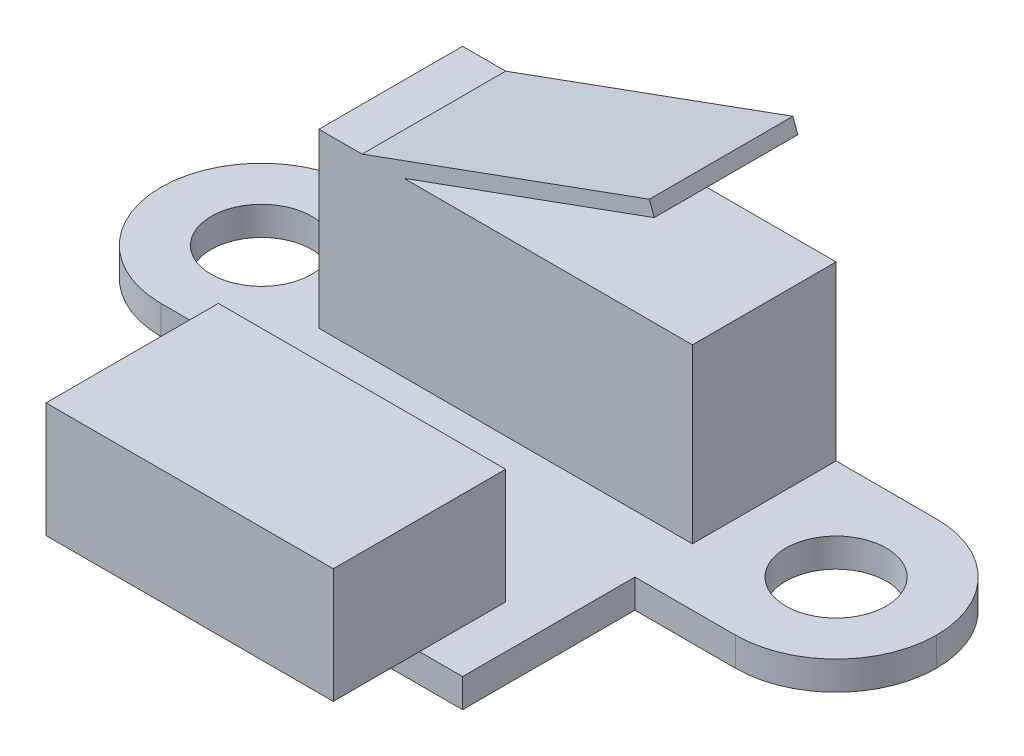
ISO-10303-21;
HEADER;
FILE_DESCRIPTION(('STEP AP214'),'2;1');
FILE_NAME('part.step','',(''),(''),'','','');
FILE_SCHEMA(('AUTOMOTIVE_DESIGN { 1 0 10303 214 1 1 1 1 }'));
ENDSEC;
DATA;
#1=APPLICATION_CONTEXT('core data for automotive mechanical design processes');
#2=APPLICATION_PROTOCOL_DEFINITION('international standard','automotive_design',2000,#1);
#3=PRODUCT_CONTEXT('',#1,'mechanical');
#4=PRODUCT('Part','Part','',(#3));
#5=PRODUCT_RELATED_PRODUCT_CATEGORY('part','',(#4));
#6=PRODUCT_DEFINITION_FORMATION('','',#4);
#7=PRODUCT_DEFINITION_CONTEXT('part definition',#1,'design');
#8=PRODUCT_DEFINITION('design','',#6,#7);
#9=PRODUCT_DEFINITION_SHAPE('','',#8);
#10=(LENGTH_UNIT() NAMED_UNIT(*) SI_UNIT(.MILLI.,.METRE.));
#11=(NAMED_UNIT(*) PLANE_ANGLE_UNIT() SI_UNIT($,.RADIAN.));
#12=(NAMED_UNIT(*) SI_UNIT($,.STERADIAN.) SOLID_ANGLE_UNIT());
#13=UNCERTAINTY_MEASURE_WITH_UNIT(LENGTH_MEASURE(1.E-05),#10,'distance_accuracy_value','');
#14=(GEOMETRIC_REPRESENTATION_CONTEXT(3) GLOBAL_UNCERTAINTY_ASSIGNED_CONTEXT((#13)) GLOBAL_UNIT_ASSIGNED_CONTEXT((#10,
#11,#12)) REPRESENTATION_CONTEXT('',''));
#15=CARTESIAN_POINT('',(0.,0.,0.));
#16=DIRECTION('',(0.,0.,1.));
#17=DIRECTION('',(1.,0.,0.));
#18=AXIS2_PLACEMENT_3D('',#15,#16,#17);
#19=CARTESIAN_POINT('',(0.,7.,0.));
#20=DIRECTION('',(0.,-1.,0.));
#21=DIRECTION('',(0.,0.,-1.));
#22=AXIS2_PLACEMENT_3D('',#19,#20,#21);
#23=PLANE('',#22);
#24=DIRECTION('',(0.,0.,1.));
#25=VECTOR('',#24,1.);
#26=CARTESIAN_POINT('',(-5.,7.,-6.5));
#27=LINE('',#26,#25);
#28=CARTESIAN_POINT('',(-5.,7.,-6.5));
#29=VERTEX_POINT('',#28);
#30=CARTESIAN_POINT('',(-5.,7.,-1.5));
#31=VERTEX_POINT('',#30);
#32=EDGE_CURVE('E229',#29,#31,#27,.T.);
#33=ORIENTED_EDGE('',*,*,#32,.F.);
#34=DIRECTION('',(-1.,0.,0.));
#35=VECTOR('',#34,1.);
#36=CARTESIAN_POINT('',(-6.5,7.,-6.5));
#37=LINE('',#36,#35);
#38=CARTESIAN_POINT('',(-6.5,7.,-6.5));
#39=VERTEX_POINT('',#38);
#40=EDGE_CURVE('E217',#29,#39,#37,.T.);
#41=ORIENTED_EDGE('',*,*,#40,.T.);
#42=DIRECTION('',(0.,0.,1.));
#43=VECTOR('',#42,1.);
#44=CARTESIAN_POINT('',(-6.5,7.,-1.5));
#45=LINE('',#44,#43);
#46=CARTESIAN_POINT('',(-6.5,7.,-1.5));
#47=VERTEX_POINT('',#46);
#48=EDGE_CURVE('E234',#39,#47,#45,.T.);
#49=ORIENTED_EDGE('',*,*,#48,.T.);
#50=DIRECTION('',(1.,0.,0.));
#51=VECTOR('',#50,1.);
#52=CARTESIAN_POINT('',(-6.5,7.,-1.5));
#53=LINE('',#52,#51);
#54=EDGE_CURVE('E709',#47,#31,#53,.T.);
#55=ORIENTED_EDGE('',*,*,#54,.T.);
#56=EDGE_LOOP('',(#33,#41,#49,#55));
#57=FACE_BOUND('',#56,.T.);
#58=ADVANCED_FACE('F34',(#57),#23,.F.);
#59=CARTESIAN_POINT('',(0.,1.,0.));
#60=DIRECTION('',(0.,-1.,0.));
#61=DIRECTION('',(0.,0.,-1.));
#62=AXIS2_PLACEMENT_3D('',#59,#60,#61);
#63=PLANE('',#62);
#64=CARTESIAN_POINT('',(-10.,1.,-3.));
#65=DIRECTION('',(0.,1.,0.));
#66=DIRECTION('',(0.,0.,1.));
#67=AXIS2_PLACEMENT_3D('',#64,#65,#66);
#68=CIRCLE('',#67,1.75);
#69=CARTESIAN_POINT('',(-10.,1.,-1.25));
#70=VERTEX_POINT('',#69);
#71=EDGE_CURVE('E282',#70,#70,#68,.T.);
#72=ORIENTED_EDGE('',*,*,#71,.F.);
#73=EDGE_LOOP('',(#72));
#74=FACE_BOUND('',#73,.T.);
#75=CARTESIAN_POINT('',(10.,1.,-3.));
#76=DIRECTION('',(0.,1.,0.));
#77=DIRECTION('',(0.,0.,1.));
#78=AXIS2_PLACEMENT_3D('',#75,#76,#77);
#79=CIRCLE('',#78,1.75);
#80=CARTESIAN_POINT('',(10.,1.,-1.25));
#81=VERTEX_POINT('',#80);
#82=EDGE_CURVE('E277',#81,#81,#79,.T.);
#83=ORIENTED_EDGE('',*,*,#82,.F.);
#84=EDGE_LOOP('',(#83));
#85=FACE_BOUND('',#84,.T.);
#86=CARTESIAN_POINT('',(10.,1.,-3.));
#87=DIRECTION('',(0.,-1.,0.));
#88=DIRECTION('',(0.,0.,-1.));
#89=AXIS2_PLACEMENT_3D('',#86,#87,#88);
#90=CIRCLE('',#89,3.5);
#91=CARTESIAN_POINT('',(10.,0.999999999999999,0.500000000000001));
#92=VERTEX_POINT('',#91);
#93=CARTESIAN_POINT('',(13.5,1.,-3.));
#94=VERTEX_POINT('',#93);
#95=EDGE_CURVE('E336',#92,#94,#90,.F.);
#96=ORIENTED_EDGE('',*,*,#95,.T.);
#97=CARTESIAN_POINT('',(10.,1.,-3.));
#98=DIRECTION('',(0.,-1.,0.));
#99=DIRECTION('',(0.,0.,-1.));
#100=AXIS2_PLACEMENT_3D('',#97,#98,#99);
#101=CIRCLE('',#100,3.5);
#102=CARTESIAN_POINT('',(9.99999999999999,1.,-6.5));
#103=VERTEX_POINT('',#102);
#104=EDGE_CURVE('E338',#94,#103,#101,.F.);
#105=ORIENTED_EDGE('',*,*,#104,.T.);
#106=DIRECTION('',(-1.,0.,0.));
#107=VECTOR('',#106,1.);
#108=CARTESIAN_POINT('',(-6.5,1.,-6.5));
#109=LINE('',#108,#107);
#110=CARTESIAN_POINT('',(6.5,1.,-6.5));
#111=VERTEX_POINT('',#110);
#112=EDGE_CURVE('E309',#103,#111,#109,.T.);
#113=ORIENTED_EDGE('',*,*,#112,.T.);
#114=DIRECTION('',(0.,0.,-1.));
#115=VECTOR('',#114,1.);
#116=CARTESIAN_POINT('',(6.5,1.,-1.5));
#117=LINE('',#116,#115);
#118=CARTESIAN_POINT('',(6.5,1.,-1.5));
#119=VERTEX_POINT('',#118);
#120=EDGE_CURVE('E232',#119,#111,#117,.T.);
#121=ORIENTED_EDGE('',*,*,#120,.F.);
#122=DIRECTION('',(1.,0.,0.));
#123=VECTOR('',#122,1.);
#124=CARTESIAN_POINT('',(-6.5,1.,-1.5));
#125=LINE('',#124,#123);
#126=CARTESIAN_POINT('',(-6.5,1.,-1.5));
#127=VERTEX_POINT('',#126);
#128=EDGE_CURVE('E228',#127,#119,#125,.T.);
#129=ORIENTED_EDGE('',*,*,#128,.F.);
#130=DIRECTION('',(0.,0.,1.));
#131=VECTOR('',#130,1.);
#132=CARTESIAN_POINT('',(-6.5,1.,-1.5));
#133=LINE('',#132,#131);
#134=CARTESIAN_POINT('',(-6.5,1.,-6.5));
#135=VERTEX_POINT('',#134);
#136=EDGE_CURVE('E225',#135,#127,#133,.T.);
#137=ORIENTED_EDGE('',*,*,#136,.F.);
#138=CARTESIAN_POINT('',(-10.,1.,-6.5));
#139=VERTEX_POINT('',#138);
#140=EDGE_CURVE('E307',#135,#139,#109,.T.);
#141=ORIENTED_EDGE('',*,*,#140,.T.);
#142=CARTESIAN_POINT('',(-10.,1.,-3.));
#143=DIRECTION('',(0.,-1.,0.));
#144=DIRECTION('',(0.,0.,-1.));
#145=AXIS2_PLACEMENT_3D('',#142,#143,#144);
#146=CIRCLE('',#145,3.5);
#147=CARTESIAN_POINT('',(-13.5,1.,-3.));
#148=VERTEX_POINT('',#147);
#149=EDGE_CURVE('E334',#139,#148,#146,.F.);
#150=ORIENTED_EDGE('',*,*,#149,.T.);
#151=CARTESIAN_POINT('',(-10.,1.,-3.));
#152=DIRECTION('',(0.,-1.,0.));
#153=DIRECTION('',(0.,0.,-1.));
#154=AXIS2_PLACEMENT_3D('',#151,#152,#153);
#155=CIRCLE('',#154,3.5);
#156=CARTESIAN_POINT('',(-10.,1.,0.500000000000001));
#157=VERTEX_POINT('',#156);
#158=EDGE_CURVE('E332',#148,#157,#155,.F.);
#159=ORIENTED_EDGE('',*,*,#158,.T.);
#160=DIRECTION('',(1.,0.,0.));
#161=VECTOR('',#160,1.);
#162=CARTESIAN_POINT('',(-13.5,1.,0.500000000000001));
#163=LINE('',#162,#161);
#164=CARTESIAN_POINT('',(-6.5,1.,0.500000000000001));
#165=VERTEX_POINT('',#164);
#166=EDGE_CURVE('E299',#157,#165,#163,.T.);
#167=ORIENTED_EDGE('',*,*,#166,.T.);
#168=DIRECTION('',(0.,0.,1.));
#169=VECTOR('',#168,1.);
#170=CARTESIAN_POINT('',(-6.5,1.,6.5));
#171=LINE('',#170,#169);
#172=CARTESIAN_POINT('',(-6.5,1.,6.5));
#173=VERTEX_POINT('',#172);
#174=EDGE_CURVE('E311',#165,#173,#171,.T.);
#175=ORIENTED_EDGE('',*,*,#174,.T.);
#176=DIRECTION('',(1.,0.,0.));
#177=VECTOR('',#176,1.);
#178=CARTESIAN_POINT('',(-6.5,1.,6.5));
#179=LINE('',#178,#177);
#180=CARTESIAN_POINT('',(-5.,1.,6.5));
#181=VERTEX_POINT('',#180);
#182=EDGE_CURVE('E314',#173,#181,#179,.T.);
#183=ORIENTED_EDGE('',*,*,#182,.T.);
#184=DIRECTION('',(0.,0.,1.));
#185=VECTOR('',#184,1.);
#186=CARTESIAN_POINT('',(-5.,1.,3.5));
#187=LINE('',#186,#185);
#188=CARTESIAN_POINT('',(-5.,1.,3.5));
#189=VERTEX_POINT('',#188);
#190=EDGE_CURVE('E255',#189,#181,#187,.T.);
#191=ORIENTED_EDGE('',*,*,#190,.F.);
#192=DIRECTION('',(-1.,0.,0.));
#193=VECTOR('',#192,1.);
#194=CARTESIAN_POINT('',(-5.,1.,3.5));
#195=LINE('',#194,#193);
#196=CARTESIAN_POINT('',(5.,1.,3.5));
#197=VERTEX_POINT('',#196);
#198=EDGE_CURVE('E248',#197,#189,#195,.T.);
#199=ORIENTED_EDGE('',*,*,#198,.F.);
#200=DIRECTION('',(0.,0.,-1.));
#201=VECTOR('',#200,1.);
#202=CARTESIAN_POINT('',(5.,1.,3.5));
#203=LINE('',#202,#201);
#204=CARTESIAN_POINT('',(5.,1.,6.5));
#205=VERTEX_POINT('',#204);
#206=EDGE_CURVE('E263',#205,#197,#203,.T.);
#207=ORIENTED_EDGE('',*,*,#206,.F.);
#208=CARTESIAN_POINT('',(6.5,1.,6.5));
#209=VERTEX_POINT('',#208);
#210=EDGE_CURVE('E313',#205,#209,#179,.T.);
#211=ORIENTED_EDGE('',*,*,#210,.T.);
#212=DIRECTION('',(0.,0.,-1.));
#213=VECTOR('',#212,1.);
#214=CARTESIAN_POINT('',(6.5,1.,6.5));
#215=LINE('',#214,#213);
#216=CARTESIAN_POINT('',(6.5,1.,0.500000000000003));
#217=VERTEX_POINT('',#216);
#218=EDGE_CURVE('E304',#209,#217,#215,.T.);
#219=ORIENTED_EDGE('',*,*,#218,.T.);
#220=DIRECTION('',(-1.,0.,0.));
#221=VECTOR('',#220,1.);
#222=CARTESIAN_POINT('',(13.5,0.999999999999999,0.500000000000001));
#223=LINE('',#222,#221);
#224=EDGE_CURVE('E294',#92,#217,#223,.T.);
#225=ORIENTED_EDGE('',*,*,#224,.F.);
#226=EDGE_LOOP('',(#96,#105,#113,#121,#129,#137,#141,#150,#159,#167,#175,#183,#191,#199,#207,
#211,#219,#225));
#227=FACE_BOUND('',#226,.T.);
#228=ADVANCED_FACE('F371',(#74,#85,#227),#63,.F.);
#229=CARTESIAN_POINT('',(6.5,1.,6.5));
#230=DIRECTION('',(-1.,0.,0.));
#231=DIRECTION('',(0.,0.,1.));
#232=AXIS2_PLACEMENT_3D('',#229,#230,#231);
#233=PLANE('',#232);
#234=DIRECTION('',(0.,-1.,0.));
#235=VECTOR('',#234,1.);
#236=CARTESIAN_POINT('',(6.5,0.999999999999999,0.500000000000001));
#237=LINE('',#236,#235);
#238=CARTESIAN_POINT('',(6.5,0.,0.500000000000001));
#239=VERTEX_POINT('',#238);
#240=EDGE_CURVE('E281',#217,#239,#237,.T.);
#241=ORIENTED_EDGE('',*,*,#240,.F.);
#242=ORIENTED_EDGE('',*,*,#218,.F.);
#243=DIRECTION('',(0.,-1.,0.));
#244=VECTOR('',#243,1.);
#245=CARTESIAN_POINT('',(6.5,1.,6.5));
#246=LINE('',#245,#244);
#247=CARTESIAN_POINT('',(6.5,0.,6.5));
#248=VERTEX_POINT('',#247);
#249=EDGE_CURVE('E317',#209,#248,#246,.T.);
#250=ORIENTED_EDGE('',*,*,#249,.T.);
#251=DIRECTION('',(0.,0.,-1.));
#252=VECTOR('',#251,1.);
#253=CARTESIAN_POINT('',(6.5,0.,6.5));
#254=LINE('',#253,#252);
#255=EDGE_CURVE('E303',#248,#239,#254,.T.);
#256=ORIENTED_EDGE('',*,*,#255,.T.);
#257=EDGE_LOOP('',(#241,#242,#250,#256));
#258=FACE_BOUND('',#257,.T.);
#259=ADVANCED_FACE('F393',(#258),#233,.F.);
#260=CARTESIAN_POINT('',(-6.5,1.,6.5));
#261=DIRECTION('',(1.,0.,0.));
#262=DIRECTION('',(0.,0.,-1.));
#263=AXIS2_PLACEMENT_3D('',#260,#261,#262);
#264=PLANE('',#263);
#265=DIRECTION('',(0.,1.,0.));
#266=VECTOR('',#265,1.);
#267=CARTESIAN_POINT('',(-6.5,0.,0.500000000000001));
#268=LINE('',#267,#266);
#269=CARTESIAN_POINT('',(-6.5,0.,0.500000000000003));
#270=VERTEX_POINT('',#269);
#271=EDGE_CURVE('E296',#270,#165,#268,.T.);
#272=ORIENTED_EDGE('',*,*,#271,.F.);
#273=DIRECTION('',(0.,0.,1.));
#274=VECTOR('',#273,1.);
#275=CARTESIAN_POINT('',(-6.5,0.,6.5));
#276=LINE('',#275,#274);
#277=CARTESIAN_POINT('',(-6.5,0.,6.5));
#278=VERTEX_POINT('',#277);
#279=EDGE_CURVE('E324',#270,#278,#276,.T.);
#280=ORIENTED_EDGE('',*,*,#279,.T.);
#281=DIRECTION('',(0.,-1.,0.));
#282=VECTOR('',#281,1.);
#283=CARTESIAN_POINT('',(-6.5,1.,6.5));
#284=LINE('',#283,#282);
#285=EDGE_CURVE('E329',#173,#278,#284,.T.);
#286=ORIENTED_EDGE('',*,*,#285,.F.);
#287=ORIENTED_EDGE('',*,*,#174,.F.);
#288=EDGE_LOOP('',(#272,#280,#286,#287));
#289=FACE_BOUND('',#288,.T.);
#290=ADVANCED_FACE('F380',(#289),#264,.F.);
#291=CARTESIAN_POINT('',(-6.5,1.,-6.5));
#292=DIRECTION('',(0.,0.,1.));
#293=DIRECTION('',(1.,0.,0.));
#294=AXIS2_PLACEMENT_3D('',#291,#292,#293);
#295=PLANE('',#294);
#296=ORIENTED_EDGE('',*,*,#112,.F.);
#297=DIRECTION('',(0.,1.,0.));
#298=VECTOR('',#297,1.);
#299=CARTESIAN_POINT('',(10.,1.,-6.5));
#300=LINE('',#299,#298);
#301=CARTESIAN_POINT('',(9.99999999999999,0.,-6.5));
#302=VERTEX_POINT('',#301);
#303=EDGE_CURVE('E343',#103,#302,#300,.F.);
#304=ORIENTED_EDGE('',*,*,#303,.T.);
#305=DIRECTION('',(-1.,0.,0.));
#306=VECTOR('',#305,1.);
#307=CARTESIAN_POINT('',(-6.5,0.,-6.5));
#308=LINE('',#307,#306);
#309=CARTESIAN_POINT('',(-10.,0.,-6.5));
#310=VERTEX_POINT('',#309);
#311=EDGE_CURVE('E321',#302,#310,#308,.T.);
#312=ORIENTED_EDGE('',*,*,#311,.T.);
#313=DIRECTION('',(0.,-1.,0.));
#314=VECTOR('',#313,1.);
#315=CARTESIAN_POINT('',(-10.,1.,-6.5));
#316=LINE('',#315,#314);
#317=EDGE_CURVE('E340',#310,#139,#316,.F.);
#318=ORIENTED_EDGE('',*,*,#317,.T.);
#319=ORIENTED_EDGE('',*,*,#140,.F.);
#320=DIRECTION('',(0.,-1.,0.));
#321=VECTOR('',#320,1.);
#322=CARTESIAN_POINT('',(-6.5,7.,-6.5));
#323=LINE('',#322,#321);
#324=EDGE_CURVE('E216',#39,#135,#323,.T.);
#325=ORIENTED_EDGE('',*,*,#324,.F.);
#326=ORIENTED_EDGE('',*,*,#40,.F.);
#327=DIRECTION('',(-0.939692620785908,-0.342020143325669,0.));
#328=VECTOR('',#327,1.);
#329=CARTESIAN_POINT('',(-5.,7.,-6.5));
#330=LINE('',#329,#328);
#331=CARTESIAN_POINT('',(5.,10.639702342662,-6.5));
#332=VERTEX_POINT('',#331);
#333=EDGE_CURVE('E198',#332,#29,#330,.T.);
#334=ORIENTED_EDGE('',*,*,#333,.F.);
#335=DIRECTION('',(-0.342020143325666,0.939692620785909,0.));
#336=VECTOR('',#335,1.);
#337=CARTESIAN_POINT('',(5.,10.639702342662,-6.5));
#338=LINE('',#337,#336);
#339=CARTESIAN_POINT('',(5.17101007166283,10.1698560322691,-6.5));
#340=VERTEX_POINT('',#339);
#341=EDGE_CURVE('E209',#340,#332,#338,.T.);
#342=ORIENTED_EDGE('',*,*,#341,.F.);
#343=DIRECTION('',(0.939692620785909,0.342020143325666,0.));
#344=VECTOR('',#343,1.);
#345=CARTESIAN_POINT('',(5.17101007166283,10.1698560322691,-6.5));
#346=LINE('',#345,#344);
#347=CARTESIAN_POINT('',(-3.53809779991855,7.,-6.5));
#348=VERTEX_POINT('',#347);
#349=EDGE_CURVE('E191',#348,#340,#346,.T.);
#350=ORIENTED_EDGE('',*,*,#349,.F.);
#351=CARTESIAN_POINT('',(6.5,7.,-6.5));
#352=VERTEX_POINT('',#351);
#353=EDGE_CURVE('E206',#352,#348,#37,.T.);
#354=ORIENTED_EDGE('',*,*,#353,.F.);
#355=DIRECTION('',(0.,-1.,0.));
#356=VECTOR('',#355,1.);
#357=CARTESIAN_POINT('',(6.5,7.,-6.5));
#358=LINE('',#357,#356);
#359=EDGE_CURVE('E220',#352,#111,#358,.T.);
#360=ORIENTED_EDGE('',*,*,#359,.T.);
#361=EDGE_LOOP('',(#296,#304,#312,#318,#319,#325,#326,#334,#342,#350,#354,#360));
#362=FACE_BOUND('',#361,.T.);
#363=ADVANCED_FACE('F204',(#362),#295,.F.);
#364=CARTESIAN_POINT('',(-6.5,1.,6.5));
#365=DIRECTION('',(0.,0.,-1.));
#366=DIRECTION('',(-1.,0.,0.));
#367=AXIS2_PLACEMENT_3D('',#364,#365,#366);
#368=PLANE('',#367);
#369=DIRECTION('',(1.,0.,0.));
#370=VECTOR('',#369,1.);
#371=CARTESIAN_POINT('',(-6.5,0.,6.5));
#372=LINE('',#371,#370);
#373=EDGE_CURVE('E308',#278,#248,#372,.T.);
#374=ORIENTED_EDGE('',*,*,#373,.T.);
#375=ORIENTED_EDGE('',*,*,#249,.F.);
#376=ORIENTED_EDGE('',*,*,#210,.F.);
#377=EDGE_CURVE('E318',#181,#205,#179,.T.);
#378=ORIENTED_EDGE('',*,*,#377,.F.);
#379=ORIENTED_EDGE('',*,*,#182,.F.);
#380=ORIENTED_EDGE('',*,*,#285,.T.);
#381=EDGE_LOOP('',(#374,#375,#376,#378,#379,#380));
#382=FACE_BOUND('',#381,.T.);
#383=ADVANCED_FACE('F387',(#382),#368,.F.);
#384=CARTESIAN_POINT('',(0.,0.,0.));
#385=DIRECTION('',(0.,-1.,0.));
#386=DIRECTION('',(0.,0.,-1.));
#387=AXIS2_PLACEMENT_3D('',#384,#385,#386);
#388=PLANE('',#387);
#389=CARTESIAN_POINT('',(-10.,0.,-3.));
#390=DIRECTION('',(0.,1.,0.));
#391=DIRECTION('',(0.,0.,1.));
#392=AXIS2_PLACEMENT_3D('',#389,#390,#391);
#393=CIRCLE('',#392,1.75);
#394=CARTESIAN_POINT('',(-10.,0.,-1.25));
#395=VERTEX_POINT('',#394);
#396=EDGE_CURVE('E278',#395,#395,#393,.T.);
#397=ORIENTED_EDGE('',*,*,#396,.T.);
#398=EDGE_LOOP('',(#397));
#399=FACE_BOUND('',#398,.T.);
#400=CARTESIAN_POINT('',(10.,0.,-3.));
#401=DIRECTION('',(0.,1.,0.));
#402=DIRECTION('',(0.,0.,1.));
#403=AXIS2_PLACEMENT_3D('',#400,#401,#402);
#404=CIRCLE('',#403,1.75);
#405=CARTESIAN_POINT('',(10.,0.,-1.25));
#406=VERTEX_POINT('',#405);
#407=EDGE_CURVE('E285',#406,#406,#404,.T.);
#408=ORIENTED_EDGE('',*,*,#407,.T.);
#409=EDGE_LOOP('',(#408));
#410=FACE_BOUND('',#409,.T.);
#411=ORIENTED_EDGE('',*,*,#311,.F.);
#412=CARTESIAN_POINT('',(10.,0.,-3.));
#413=DIRECTION('',(0.,-1.,0.));
#414=DIRECTION('',(0.,0.,-1.));
#415=AXIS2_PLACEMENT_3D('',#412,#413,#414);
#416=CIRCLE('',#415,3.5);
#417=CARTESIAN_POINT('',(13.5,0.,-3.));
#418=VERTEX_POINT('',#417);
#419=EDGE_CURVE('E56',#302,#418,#416,.T.);
#420=ORIENTED_EDGE('',*,*,#419,.T.);
#421=CARTESIAN_POINT('',(10.,0.,-3.));
#422=DIRECTION('',(0.,-1.,0.));
#423=DIRECTION('',(0.,0.,-1.));
#424=AXIS2_PLACEMENT_3D('',#421,#422,#423);
#425=CIRCLE('',#424,3.5);
#426=CARTESIAN_POINT('',(10.,0.,0.500000000000001));
#427=VERTEX_POINT('',#426);
#428=EDGE_CURVE('E51',#418,#427,#425,.T.);
#429=ORIENTED_EDGE('',*,*,#428,.T.);
#430=DIRECTION('',(-1.,0.,0.));
#431=VECTOR('',#430,1.);
#432=CARTESIAN_POINT('',(13.5,0.,0.500000000000001));
#433=LINE('',#432,#431);
#434=EDGE_CURVE('E292',#427,#239,#433,.T.);
#435=ORIENTED_EDGE('',*,*,#434,.T.);
#436=ORIENTED_EDGE('',*,*,#255,.F.);
#437=ORIENTED_EDGE('',*,*,#373,.F.);
#438=ORIENTED_EDGE('',*,*,#279,.F.);
#439=DIRECTION('',(1.,0.,0.));
#440=VECTOR('',#439,1.);
#441=CARTESIAN_POINT('',(-13.5,0.,0.500000000000001));
#442=LINE('',#441,#440);
#443=CARTESIAN_POINT('',(-10.,0.,0.500000000000001));
#444=VERTEX_POINT('',#443);
#445=EDGE_CURVE('E301',#444,#270,#442,.T.);
#446=ORIENTED_EDGE('',*,*,#445,.F.);
#447=CARTESIAN_POINT('',(-10.,0.,-3.));
#448=DIRECTION('',(0.,-1.,0.));
#449=DIRECTION('',(0.,0.,-1.));
#450=AXIS2_PLACEMENT_3D('',#447,#448,#449);
#451=CIRCLE('',#450,3.5);
#452=CARTESIAN_POINT('',(-13.5,0.,-3.));
#453=VERTEX_POINT('',#452);
#454=EDGE_CURVE('E346',#444,#453,#451,.T.);
#455=ORIENTED_EDGE('',*,*,#454,.T.);
#456=CARTESIAN_POINT('',(-10.,0.,-3.));
#457=DIRECTION('',(0.,-1.,0.));
#458=DIRECTION('',(0.,0.,-1.));
#459=AXIS2_PLACEMENT_3D('',#456,#457,#458);
#460=CIRCLE('',#459,3.5);
#461=EDGE_CURVE('E348',#453,#310,#460,.T.);
#462=ORIENTED_EDGE('',*,*,#461,.T.);
#463=EDGE_LOOP('',(#411,#420,#429,#435,#436,#437,#438,#446,#455,#462));
#464=FACE_BOUND('',#463,.T.);
#465=ADVANCED_FACE('F383',(#399,#410,#464),#388,.T.);
#466=CARTESIAN_POINT('',(-13.5,0.,0.500000000000001));
#467=DIRECTION('',(0.,0.,-1.));
#468=DIRECTION('',(-1.,0.,0.));
#469=AXIS2_PLACEMENT_3D('',#466,#467,#468);
#470=PLANE('',#469);
#471=ORIENTED_EDGE('',*,*,#166,.F.);
#472=DIRECTION('',(0.,1.,0.));
#473=VECTOR('',#472,1.);
#474=CARTESIAN_POINT('',(-10.,0.,0.500000000000001));
#475=LINE('',#474,#473);
#476=EDGE_CURVE('E11',#157,#444,#475,.F.);
#477=ORIENTED_EDGE('',*,*,#476,.T.);
#478=ORIENTED_EDGE('',*,*,#445,.T.);
#479=ORIENTED_EDGE('',*,*,#271,.T.);
#480=EDGE_LOOP('',(#471,#477,#478,#479));
#481=FACE_BOUND('',#480,.T.);
#482=ADVANCED_FACE('F375',(#481),#470,.F.);
#483=CARTESIAN_POINT('',(13.5,0.999999999999999,0.500000000000001));
#484=DIRECTION('',(0.,0.,-1.));
#485=DIRECTION('',(-1.,0.,0.));
#486=AXIS2_PLACEMENT_3D('',#483,#484,#485);
#487=PLANE('',#486);
#488=ORIENTED_EDGE('',*,*,#434,.F.);
#489=DIRECTION('',(0.,-1.,0.));
#490=VECTOR('',#489,1.);
#491=CARTESIAN_POINT('',(10.,0.999999999999999,0.500000000000001));
#492=LINE('',#491,#490);
#493=EDGE_CURVE('E43',#427,#92,#492,.F.);
#494=ORIENTED_EDGE('',*,*,#493,.T.);
#495=ORIENTED_EDGE('',*,*,#224,.T.);
#496=ORIENTED_EDGE('',*,*,#240,.T.);
#497=EDGE_LOOP('',(#488,#494,#495,#496));
#498=FACE_BOUND('',#497,.T.);
#499=ADVANCED_FACE('F466',(#498),#487,.F.);
#500=CARTESIAN_POINT('',(10.,0.,-3.));
#501=DIRECTION('',(0.,1.,0.));
#502=DIRECTION('',(0.,0.,1.));
#503=AXIS2_PLACEMENT_3D('',#500,#501,#502);
#504=CYLINDRICAL_SURFACE('',#503,1.75);
#505=ORIENTED_EDGE('',*,*,#407,.F.);
#506=EDGE_LOOP('',(#505));
#507=FACE_BOUND('',#506,.T.);
#508=ORIENTED_EDGE('',*,*,#82,.T.);
#509=EDGE_LOOP('',(#508));
#510=FACE_BOUND('',#509,.T.);
#511=ADVANCED_FACE('F468',(#507,#510),#504,.F.);
#512=CARTESIAN_POINT('',(-10.,0.,-3.));
#513=DIRECTION('',(0.,1.,0.));
#514=DIRECTION('',(0.,0.,1.));
#515=AXIS2_PLACEMENT_3D('',#512,#513,#514);
#516=CYLINDRICAL_SURFACE('',#515,1.75);
#517=ORIENTED_EDGE('',*,*,#396,.F.);
#518=EDGE_LOOP('',(#517));
#519=FACE_BOUND('',#518,.T.);
#520=ORIENTED_EDGE('',*,*,#71,.T.);
#521=EDGE_LOOP('',(#520));
#522=FACE_BOUND('',#521,.T.);
#523=ADVANCED_FACE('F474',(#519,#522),#516,.F.);
#524=CARTESIAN_POINT('',(0.,1.,0.));
#525=DIRECTION('',(0.,1.,0.));
#526=DIRECTION('',(0.,0.,1.));
#527=AXIS2_PLACEMENT_3D('',#524,#525,#526);
#528=PLANE('',#527);
#529=CARTESIAN_POINT('',(-5.,1.,9.5));
#530=VERTEX_POINT('',#529);
#531=EDGE_CURVE('E243',#181,#530,#187,.T.);
#532=ORIENTED_EDGE('',*,*,#531,.F.);
#533=ORIENTED_EDGE('',*,*,#377,.T.);
#534=CARTESIAN_POINT('',(5.,1.,9.5));
#535=VERTEX_POINT('',#534);
#536=EDGE_CURVE('E260',#535,#205,#203,.T.);
#537=ORIENTED_EDGE('',*,*,#536,.F.);
#538=DIRECTION('',(1.,0.,0.));
#539=VECTOR('',#538,1.);
#540=CARTESIAN_POINT('',(-5.,1.,9.5));
#541=LINE('',#540,#539);
#542=EDGE_CURVE('E258',#530,#535,#541,.T.);
#543=ORIENTED_EDGE('',*,*,#542,.F.);
#544=EDGE_LOOP('',(#532,#533,#537,#543));
#545=FACE_BOUND('',#544,.T.);
#546=ADVANCED_FACE('F401',(#545),#528,.F.);
#547=CARTESIAN_POINT('',(-5.,5.,3.5));
#548=DIRECTION('',(1.,0.,0.));
#549=DIRECTION('',(0.,0.,-1.));
#550=AXIS2_PLACEMENT_3D('',#547,#548,#549);
#551=PLANE('',#550);
#552=ORIENTED_EDGE('',*,*,#190,.T.);
#553=ORIENTED_EDGE('',*,*,#531,.T.);
#554=DIRECTION('',(0.,-1.,0.));
#555=VECTOR('',#554,1.);
#556=CARTESIAN_POINT('',(-5.,5.,9.5));
#557=LINE('',#556,#555);
#558=CARTESIAN_POINT('',(-5.,5.,9.5));
#559=VERTEX_POINT('',#558);
#560=EDGE_CURVE('E274',#559,#530,#557,.T.);
#561=ORIENTED_EDGE('',*,*,#560,.F.);
#562=DIRECTION('',(0.,0.,1.));
#563=VECTOR('',#562,1.);
#564=CARTESIAN_POINT('',(-5.,5.,3.5));
#565=LINE('',#564,#563);
#566=CARTESIAN_POINT('',(-5.,5.,3.5));
#567=VERTEX_POINT('',#566);
#568=EDGE_CURVE('E244',#567,#559,#565,.T.);
#569=ORIENTED_EDGE('',*,*,#568,.F.);
#570=DIRECTION('',(0.,-1.,0.));
#571=VECTOR('',#570,1.);
#572=CARTESIAN_POINT('',(-5.,5.,3.5));
#573=LINE('',#572,#571);
#574=EDGE_CURVE('E254',#567,#189,#573,.T.);
#575=ORIENTED_EDGE('',*,*,#574,.T.);
#576=EDGE_LOOP('',(#552,#553,#561,#569,#575));
#577=FACE_BOUND('',#576,.T.);
#578=ADVANCED_FACE('F413',(#577),#551,.F.);
#579=CARTESIAN_POINT('',(-5.,5.,9.5));
#580=DIRECTION('',(0.,0.,-1.));
#581=DIRECTION('',(-1.,0.,0.));
#582=AXIS2_PLACEMENT_3D('',#579,#580,#581);
#583=PLANE('',#582);
#584=ORIENTED_EDGE('',*,*,#542,.T.);
#585=DIRECTION('',(0.,-1.,0.));
#586=VECTOR('',#585,1.);
#587=CARTESIAN_POINT('',(5.,5.,9.5));
#588=LINE('',#587,#586);
#589=CARTESIAN_POINT('',(5.,5.,9.5));
#590=VERTEX_POINT('',#589);
#591=EDGE_CURVE('E271',#590,#535,#588,.T.);
#592=ORIENTED_EDGE('',*,*,#591,.F.);
#593=DIRECTION('',(1.,0.,0.));
#594=VECTOR('',#593,1.);
#595=CARTESIAN_POINT('',(-5.,5.,9.5));
#596=LINE('',#595,#594);
#597=EDGE_CURVE('E247',#559,#590,#596,.T.);
#598=ORIENTED_EDGE('',*,*,#597,.F.);
#599=ORIENTED_EDGE('',*,*,#560,.T.);
#600=EDGE_LOOP('',(#584,#592,#598,#599));
#601=FACE_BOUND('',#600,.T.);
#602=ADVANCED_FACE('F409',(#601),#583,.F.);
#603=CARTESIAN_POINT('',(5.,5.,3.5));
#604=DIRECTION('',(-1.,0.,0.));
#605=DIRECTION('',(0.,0.,1.));
#606=AXIS2_PLACEMENT_3D('',#603,#604,#605);
#607=PLANE('',#606);
#608=ORIENTED_EDGE('',*,*,#536,.T.);
#609=ORIENTED_EDGE('',*,*,#206,.T.);
#610=DIRECTION('',(0.,-1.,0.));
#611=VECTOR('',#610,1.);
#612=CARTESIAN_POINT('',(5.,5.,3.5));
#613=LINE('',#612,#611);
#614=CARTESIAN_POINT('',(5.,5.,3.5));
#615=VERTEX_POINT('',#614);
#616=EDGE_CURVE('E268',#615,#197,#613,.T.);
#617=ORIENTED_EDGE('',*,*,#616,.F.);
#618=DIRECTION('',(0.,0.,-1.));
#619=VECTOR('',#618,1.);
#620=CARTESIAN_POINT('',(5.,5.,3.5));
#621=LINE('',#620,#619);
#622=EDGE_CURVE('E250',#590,#615,#621,.T.);
#623=ORIENTED_EDGE('',*,*,#622,.F.);
#624=ORIENTED_EDGE('',*,*,#591,.T.);
#625=EDGE_LOOP('',(#608,#609,#617,#623,#624));
#626=FACE_BOUND('',#625,.T.);
#627=ADVANCED_FACE('F404',(#626),#607,.F.);
#628=CARTESIAN_POINT('',(-5.,5.,3.5));
#629=DIRECTION('',(0.,0.,1.));
#630=DIRECTION('',(1.,0.,0.));
#631=AXIS2_PLACEMENT_3D('',#628,#629,#630);
#632=PLANE('',#631);
#633=ORIENTED_EDGE('',*,*,#198,.T.);
#634=ORIENTED_EDGE('',*,*,#574,.F.);
#635=DIRECTION('',(-1.,0.,0.));
#636=VECTOR('',#635,1.);
#637=CARTESIAN_POINT('',(-5.,5.,3.5));
#638=LINE('',#637,#636);
#639=EDGE_CURVE('E252',#615,#567,#638,.T.);
#640=ORIENTED_EDGE('',*,*,#639,.F.);
#641=ORIENTED_EDGE('',*,*,#616,.T.);
#642=EDGE_LOOP('',(#633,#634,#640,#641));
#643=FACE_BOUND('',#642,.T.);
#644=ADVANCED_FACE('F416',(#643),#632,.F.);
#645=CARTESIAN_POINT('',(0.,5.,0.));
#646=DIRECTION('',(0.,1.,0.));
#647=DIRECTION('',(0.,0.,1.));
#648=AXIS2_PLACEMENT_3D('',#645,#646,#647);
#649=PLANE('',#648);
#650=ORIENTED_EDGE('',*,*,#568,.T.);
#651=ORIENTED_EDGE('',*,*,#597,.T.);
#652=ORIENTED_EDGE('',*,*,#622,.T.);
#653=ORIENTED_EDGE('',*,*,#639,.T.);
#654=EDGE_LOOP('',(#650,#651,#652,#653));
#655=FACE_BOUND('',#654,.T.);
#656=ADVANCED_FACE('F419',(#655),#649,.T.);
#657=CARTESIAN_POINT('',(-6.5,7.,-1.5));
#658=DIRECTION('',(1.,0.,0.));
#659=DIRECTION('',(0.,0.,-1.));
#660=AXIS2_PLACEMENT_3D('',#657,#658,#659);
#661=PLANE('',#660);
#662=ORIENTED_EDGE('',*,*,#136,.T.);
#663=DIRECTION('',(0.,-1.,0.));
#664=VECTOR('',#663,1.);
#665=CARTESIAN_POINT('',(-6.5,7.,-1.5));
#666=LINE('',#665,#664);
#667=EDGE_CURVE('E240',#47,#127,#666,.T.);
#668=ORIENTED_EDGE('',*,*,#667,.F.);
#669=ORIENTED_EDGE('',*,*,#48,.F.);
#670=ORIENTED_EDGE('',*,*,#324,.T.);
#671=EDGE_LOOP('',(#662,#668,#669,#670));
#672=FACE_BOUND('',#671,.T.);
#673=ADVANCED_FACE('F421',(#672),#661,.F.);
#674=CARTESIAN_POINT('',(-6.5,7.,-1.5));
#675=DIRECTION('',(0.,0.,-1.));
#676=DIRECTION('',(-1.,0.,0.));
#677=AXIS2_PLACEMENT_3D('',#674,#675,#676);
#678=PLANE('',#677);
#679=ORIENTED_EDGE('',*,*,#128,.T.);
#680=DIRECTION('',(0.,-1.,0.));
#681=VECTOR('',#680,1.);
#682=CARTESIAN_POINT('',(6.5,7.,-1.5));
#683=LINE('',#682,#681);
#684=CARTESIAN_POINT('',(6.5,7.,-1.5));
#685=VERTEX_POINT('',#684);
#686=EDGE_CURVE('E237',#685,#119,#683,.T.);
#687=ORIENTED_EDGE('',*,*,#686,.F.);
#688=CARTESIAN_POINT('',(-3.53809779991855,7.,-1.5));
#689=VERTEX_POINT('',#688);
#690=EDGE_CURVE('E708',#689,#685,#53,.T.);
#691=ORIENTED_EDGE('',*,*,#690,.F.);
#692=DIRECTION('',(0.939692620785909,0.342020143325666,0.));
#693=VECTOR('',#692,1.);
#694=CARTESIAN_POINT('',(5.17101007166283,10.1698560322691,-1.5));
#695=LINE('',#694,#693);
#696=CARTESIAN_POINT('',(5.17101007166283,10.1698560322691,-1.5));
#697=VERTEX_POINT('',#696);
#698=EDGE_CURVE('E193',#689,#697,#695,.T.);
#699=ORIENTED_EDGE('',*,*,#698,.T.);
#700=DIRECTION('',(-0.342020143325666,0.939692620785909,0.));
#701=VECTOR('',#700,1.);
#702=CARTESIAN_POINT('',(5.,10.639702342662,-1.5));
#703=LINE('',#702,#701);
#704=CARTESIAN_POINT('',(5.,10.639702342662,-1.5));
#705=VERTEX_POINT('',#704);
#706=EDGE_CURVE('E357',#697,#705,#703,.T.);
#707=ORIENTED_EDGE('',*,*,#706,.T.);
#708=DIRECTION('',(-0.939692620785908,-0.342020143325669,0.));
#709=VECTOR('',#708,1.);
#710=CARTESIAN_POINT('',(-5.,7.,-1.5));
#711=LINE('',#710,#709);
#712=EDGE_CURVE('E210',#705,#31,#711,.T.);
#713=ORIENTED_EDGE('',*,*,#712,.T.);
#714=ORIENTED_EDGE('',*,*,#54,.F.);
#715=ORIENTED_EDGE('',*,*,#667,.T.);
#716=EDGE_LOOP('',(#679,#687,#691,#699,#707,#713,#714,#715));
#717=FACE_BOUND('',#716,.T.);
#718=ADVANCED_FACE('F427',(#717),#678,.F.);
#719=CARTESIAN_POINT('',(6.5,7.,-1.5));
#720=DIRECTION('',(-1.,0.,0.));
#721=DIRECTION('',(0.,0.,1.));
#722=AXIS2_PLACEMENT_3D('',#719,#720,#721);
#723=PLANE('',#722);
#724=ORIENTED_EDGE('',*,*,#120,.T.);
#725=ORIENTED_EDGE('',*,*,#359,.F.);
#726=DIRECTION('',(0.,0.,-1.));
#727=VECTOR('',#726,1.);
#728=CARTESIAN_POINT('',(6.5,7.,-1.5));
#729=LINE('',#728,#727);
#730=EDGE_CURVE('E214',#685,#352,#729,.T.);
#731=ORIENTED_EDGE('',*,*,#730,.F.);
#732=ORIENTED_EDGE('',*,*,#686,.T.);
#733=EDGE_LOOP('',(#724,#725,#731,#732));
#734=FACE_BOUND('',#733,.T.);
#735=ADVANCED_FACE('F445',(#734),#723,.F.);
#736=ORIENTED_EDGE('',*,*,#353,.T.);
#737=DIRECTION('',(0.,0.,1.));
#738=VECTOR('',#737,1.);
#739=CARTESIAN_POINT('',(-3.53809779991855,7.,-6.5));
#740=LINE('',#739,#738);
#741=EDGE_CURVE('E188',#348,#689,#740,.T.);
#742=ORIENTED_EDGE('',*,*,#741,.T.);
#743=ORIENTED_EDGE('',*,*,#690,.T.);
#744=ORIENTED_EDGE('',*,*,#730,.T.);
#745=EDGE_LOOP('',(#736,#742,#743,#744));
#746=FACE_BOUND('',#745,.T.);
#747=ADVANCED_FACE('F212',(#746),#23,.F.);
#748=CARTESIAN_POINT('',(-5.,7.,-6.5));
#749=DIRECTION('',(-0.342020143325669,0.939692620785908,0.));
#750=DIRECTION('',(-0.939692620785908,-0.342020143325669,0.));
#751=AXIS2_PLACEMENT_3D('',#748,#749,#750);
#752=PLANE('',#751);
#753=ORIENTED_EDGE('',*,*,#712,.F.);
#754=DIRECTION('',(0.,0.,1.));
#755=VECTOR('',#754,1.);
#756=CARTESIAN_POINT('',(5.,10.639702342662,-6.5));
#757=LINE('',#756,#755);
#758=EDGE_CURVE('E704',#332,#705,#757,.T.);
#759=ORIENTED_EDGE('',*,*,#758,.F.);
#760=ORIENTED_EDGE('',*,*,#333,.T.);
#761=ORIENTED_EDGE('',*,*,#32,.T.);
#762=EDGE_LOOP('',(#753,#759,#760,#761));
#763=FACE_BOUND('',#762,.T.);
#764=ADVANCED_FACE('F444',(#763),#752,.T.);
#765=CARTESIAN_POINT('',(5.,10.639702342662,-6.5));
#766=DIRECTION('',(0.939692620785909,0.342020143325666,0.));
#767=DIRECTION('',(-0.342020143325666,0.939692620785909,0.));
#768=AXIS2_PLACEMENT_3D('',#765,#766,#767);
#769=PLANE('',#768);
#770=ORIENTED_EDGE('',*,*,#706,.F.);
#771=DIRECTION('',(0.,0.,1.));
#772=VECTOR('',#771,1.);
#773=CARTESIAN_POINT('',(5.17101007166283,10.1698560322691,-6.5));
#774=LINE('',#773,#772);
#775=EDGE_CURVE('E197',#340,#697,#774,.T.);
#776=ORIENTED_EDGE('',*,*,#775,.F.);
#777=ORIENTED_EDGE('',*,*,#341,.T.);
#778=ORIENTED_EDGE('',*,*,#758,.T.);
#779=EDGE_LOOP('',(#770,#776,#777,#778));
#780=FACE_BOUND('',#779,.T.);
#781=ADVANCED_FACE('F450',(#780),#769,.T.);
#782=CARTESIAN_POINT('',(5.17101007166283,10.1698560322691,-6.5));
#783=DIRECTION('',(0.342020143325666,-0.939692620785909,0.));
#784=DIRECTION('',(0.939692620785909,0.342020143325666,0.));
#785=AXIS2_PLACEMENT_3D('',#782,#783,#784);
#786=PLANE('',#785);
#787=ORIENTED_EDGE('',*,*,#698,.F.);
#788=ORIENTED_EDGE('',*,*,#741,.F.);
#789=ORIENTED_EDGE('',*,*,#349,.T.);
#790=ORIENTED_EDGE('',*,*,#775,.T.);
#791=EDGE_LOOP('',(#787,#788,#789,#790));
#792=FACE_BOUND('',#791,.T.);
#793=ADVANCED_FACE('F190',(#792),#786,.T.);
#794=CARTESIAN_POINT('',(10.,0.,-3.));
#795=DIRECTION('',(0.,-1.,0.));
#796=DIRECTION('',(0.,0.,-1.));
#797=AXIS2_PLACEMENT_3D('',#794,#795,#796);
#798=CYLINDRICAL_SURFACE('',#797,3.5);
#799=ORIENTED_EDGE('',*,*,#493,.F.);
#800=ORIENTED_EDGE('',*,*,#428,.F.);
#801=DIRECTION('',(0.,-1.,0.));
#802=VECTOR('',#801,1.);
#803=CARTESIAN_POINT('',(13.5,0.,-3.));
#804=LINE('',#803,#802);
#805=EDGE_CURVE('E352',#94,#418,#804,.T.);
#806=ORIENTED_EDGE('',*,*,#805,.F.);
#807=ORIENTED_EDGE('',*,*,#95,.F.);
#808=EDGE_LOOP('',(#799,#800,#806,#807));
#809=FACE_BOUND('',#808,.T.);
#810=ADVANCED_FACE('F464',(#809),#798,.T.);
#811=CARTESIAN_POINT('',(10.,0.,-3.));
#812=DIRECTION('',(0.,1.,0.));
#813=DIRECTION('',(0.,0.,1.));
#814=AXIS2_PLACEMENT_3D('',#811,#812,#813);
#815=CYLINDRICAL_SURFACE('',#814,3.5);
#816=ORIENTED_EDGE('',*,*,#419,.F.);
#817=ORIENTED_EDGE('',*,*,#303,.F.);
#818=ORIENTED_EDGE('',*,*,#104,.F.);
#819=ORIENTED_EDGE('',*,*,#805,.T.);
#820=EDGE_LOOP('',(#816,#817,#818,#819));
#821=FACE_BOUND('',#820,.T.);
#822=ADVANCED_FACE('F461',(#821),#815,.T.);
#823=CARTESIAN_POINT('',(-10.,0.,-3.));
#824=DIRECTION('',(0.,1.,0.));
#825=DIRECTION('',(0.,0.,1.));
#826=AXIS2_PLACEMENT_3D('',#823,#824,#825);
#827=CYLINDRICAL_SURFACE('',#826,3.5);
#828=ORIENTED_EDGE('',*,*,#476,.F.);
#829=ORIENTED_EDGE('',*,*,#158,.F.);
#830=DIRECTION('',(0.,1.,0.));
#831=VECTOR('',#830,1.);
#832=CARTESIAN_POINT('',(-13.5,0.,-3.));
#833=LINE('',#832,#831);
#834=EDGE_CURVE('E38',#453,#148,#833,.T.);
#835=ORIENTED_EDGE('',*,*,#834,.F.);
#836=ORIENTED_EDGE('',*,*,#454,.F.);
#837=EDGE_LOOP('',(#828,#829,#835,#836));
#838=FACE_BOUND('',#837,.T.);
#839=ADVANCED_FACE('F36',(#838),#827,.T.);
#840=CARTESIAN_POINT('',(-10.,0.,-3.));
#841=DIRECTION('',(0.,-1.,0.));
#842=DIRECTION('',(0.,0.,-1.));
#843=AXIS2_PLACEMENT_3D('',#840,#841,#842);
#844=CYLINDRICAL_SURFACE('',#843,3.5);
#845=ORIENTED_EDGE('',*,*,#149,.F.);
#846=ORIENTED_EDGE('',*,*,#317,.F.);
#847=ORIENTED_EDGE('',*,*,#461,.F.);
#848=ORIENTED_EDGE('',*,*,#834,.T.);
#849=EDGE_LOOP('',(#845,#846,#847,#848));
#850=FACE_BOUND('',#849,.T.);
#851=ADVANCED_FACE('F363',(#850),#844,.T.);
#852=CLOSED_SHELL('',(#58,#228,#259,#290,#363,#383,#465,#482,#499,#511,#523,#546,#578,#602,#627,
#644,#656,#673,#718,#735,#747,#764,#781,#793,#810,#822,#839,#851));
#853=MANIFOLD_SOLID_BREP('B2',#852);
#854=ADVANCED_BREP_SHAPE_REPRESENTATION('',(#18,#853),#14);
#855=SHAPE_DEFINITION_REPRESENTATION(#9,#854);
ENDSEC;
END-ISO-10303-21;
